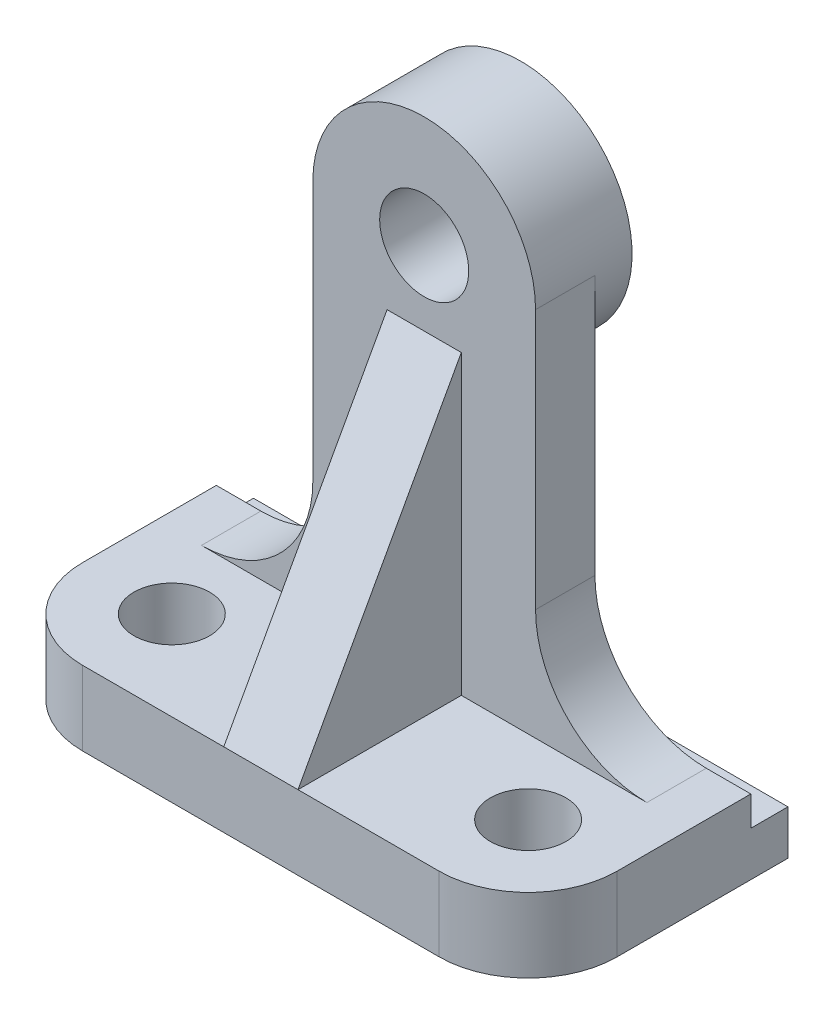
ISO-10303-21;
HEADER;
FILE_DESCRIPTION(('STEP AP214'),'2;1');
FILE_NAME('part.step','',(''),(''),'','','');
FILE_SCHEMA(('AUTOMOTIVE_DESIGN { 1 0 10303 214 1 1 1 1 }'));
ENDSEC;
DATA;
#1=APPLICATION_CONTEXT('core data for automotive mechanical design processes');
#2=APPLICATION_PROTOCOL_DEFINITION('international standard','automotive_design',2000,#1);
#3=PRODUCT_CONTEXT('',#1,'mechanical');
#4=PRODUCT('Part','Part','',(#3));
#5=PRODUCT_RELATED_PRODUCT_CATEGORY('part','',(#4));
#6=PRODUCT_DEFINITION_FORMATION('','',#4);
#7=PRODUCT_DEFINITION_CONTEXT('part definition',#1,'design');
#8=PRODUCT_DEFINITION('design','',#6,#7);
#9=PRODUCT_DEFINITION_SHAPE('','',#8);
#10=(LENGTH_UNIT() NAMED_UNIT(*) SI_UNIT(.MILLI.,.METRE.));
#11=(NAMED_UNIT(*) PLANE_ANGLE_UNIT() SI_UNIT($,.RADIAN.));
#12=(NAMED_UNIT(*) SI_UNIT($,.STERADIAN.) SOLID_ANGLE_UNIT());
#13=UNCERTAINTY_MEASURE_WITH_UNIT(LENGTH_MEASURE(1.E-05),#10,'distance_accuracy_value','');
#14=(GEOMETRIC_REPRESENTATION_CONTEXT(3) GLOBAL_UNCERTAINTY_ASSIGNED_CONTEXT((#13)) GLOBAL_UNIT_ASSIGNED_CONTEXT((#10,
#11,#12)) REPRESENTATION_CONTEXT('',''));
#15=CARTESIAN_POINT('',(0.,0.,0.));
#16=DIRECTION('',(0.,0.,1.));
#17=DIRECTION('',(1.,0.,0.));
#18=AXIS2_PLACEMENT_3D('',#15,#16,#17);
#19=CARTESIAN_POINT('',(0.,10.,0.));
#20=DIRECTION('',(0.,-1.,0.));
#21=DIRECTION('',(0.,0.,-1.));
#22=AXIS2_PLACEMENT_3D('',#19,#20,#21);
#23=PLANE('',#22);
#24=CARTESIAN_POINT('',(-24.,10.,5.5));
#25=DIRECTION('',(0.,-1.,0.));
#26=DIRECTION('',(0.,0.,-1.));
#27=AXIS2_PLACEMENT_3D('',#24,#25,#26);
#28=CIRCLE('',#27,5.09999999999999);
#29=CARTESIAN_POINT('',(-24.,10.,0.40000000000001));
#30=VERTEX_POINT('',#29);
#31=EDGE_CURVE('E290',#30,#30,#28,.T.);
#32=ORIENTED_EDGE('',*,*,#31,.T.);
#33=EDGE_LOOP('',(#32));
#34=FACE_BOUND('',#33,.T.);
#35=DIRECTION('',(0.,0.,1.));
#36=VECTOR('',#35,1.);
#37=CARTESIAN_POINT('',(-5.,10.,0.));
#38=LINE('',#37,#36);
#39=CARTESIAN_POINT('',(-5.,10.,-4.5));
#40=VERTEX_POINT('',#39);
#41=CARTESIAN_POINT('',(-5.,10.,17.5));
#42=VERTEX_POINT('',#41);
#43=EDGE_CURVE('E153',#40,#42,#38,.T.);
#44=ORIENTED_EDGE('',*,*,#43,.F.);
#45=DIRECTION('',(-1.,0.,0.));
#46=VECTOR('',#45,1.);
#47=CARTESIAN_POINT('',(-15.,10.,-4.5));
#48=LINE('',#47,#46);
#49=CARTESIAN_POINT('',(-30.,10.,-4.5));
#50=VERTEX_POINT('',#49);
#51=EDGE_CURVE('E266',#40,#50,#48,.T.);
#52=ORIENTED_EDGE('',*,*,#51,.T.);
#53=DIRECTION('',(0.,0.,-1.));
#54=VECTOR('',#53,1.);
#55=CARTESIAN_POINT('',(-30.,10.,0.));
#56=LINE('',#55,#54);
#57=CARTESIAN_POINT('',(-30.,10.,-12.5));
#58=VERTEX_POINT('',#57);
#59=EDGE_CURVE('E227',#50,#58,#56,.T.);
#60=ORIENTED_EDGE('',*,*,#59,.T.);
#61=DIRECTION('',(1.,0.,0.));
#62=VECTOR('',#61,1.);
#63=CARTESIAN_POINT('',(-36.,10.,-12.5));
#64=LINE('',#63,#62);
#65=CARTESIAN_POINT('',(-36.,10.,-12.5));
#66=VERTEX_POINT('',#65);
#67=EDGE_CURVE('E256',#66,#58,#64,.T.);
#68=ORIENTED_EDGE('',*,*,#67,.F.);
#69=DIRECTION('',(0.,0.,1.));
#70=VECTOR('',#69,1.);
#71=CARTESIAN_POINT('',(-36.,10.,17.5));
#72=LINE('',#71,#70);
#73=CARTESIAN_POINT('',(-36.,10.,5.5));
#74=VERTEX_POINT('',#73);
#75=EDGE_CURVE('E189',#66,#74,#72,.T.);
#76=ORIENTED_EDGE('',*,*,#75,.T.);
#77=CARTESIAN_POINT('',(-24.,10.,5.5));
#78=DIRECTION('',(0.,-1.,0.));
#79=DIRECTION('',(0.,0.,-1.));
#80=AXIS2_PLACEMENT_3D('',#77,#78,#79);
#81=CIRCLE('',#80,12.);
#82=CARTESIAN_POINT('',(-24.,10.,17.5));
#83=VERTEX_POINT('',#82);
#84=EDGE_CURVE('E183',#74,#83,#81,.F.);
#85=ORIENTED_EDGE('',*,*,#84,.T.);
#86=DIRECTION('',(1.,0.,0.));
#87=VECTOR('',#86,1.);
#88=CARTESIAN_POINT('',(-36.,10.,17.5));
#89=LINE('',#88,#87);
#90=EDGE_CURVE('E176',#83,#42,#89,.T.);
#91=ORIENTED_EDGE('',*,*,#90,.T.);
#92=EDGE_LOOP('',(#44,#52,#60,#68,#76,#85,#91));
#93=FACE_BOUND('',#92,.T.);
#94=ADVANCED_FACE('F37',(#34,#93),#23,.F.);
#95=CARTESIAN_POINT('',(-36.,10.,-12.5));
#96=DIRECTION('',(0.,0.,1.));
#97=DIRECTION('',(1.,0.,0.));
#98=AXIS2_PLACEMENT_3D('',#95,#96,#97);
#99=PLANE('',#98);
#100=DIRECTION('',(0.,-1.,0.));
#101=VECTOR('',#100,1.);
#102=CARTESIAN_POINT('',(36.,10.,-12.5));
#103=LINE('',#102,#101);
#104=CARTESIAN_POINT('',(36.,10.,-12.5));
#105=VERTEX_POINT('',#104);
#106=CARTESIAN_POINT('',(36.,6.,-12.5));
#107=VERTEX_POINT('',#106);
#108=EDGE_CURVE('E302',#105,#107,#103,.T.);
#109=ORIENTED_EDGE('',*,*,#108,.T.);
#110=DIRECTION('',(1.,0.,0.));
#111=VECTOR('',#110,1.);
#112=CARTESIAN_POINT('',(-36.,6.,-12.5));
#113=LINE('',#112,#111);
#114=CARTESIAN_POINT('',(-36.,6.,-12.5));
#115=VERTEX_POINT('',#114);
#116=EDGE_CURVE('E313',#115,#107,#113,.T.);
#117=ORIENTED_EDGE('',*,*,#116,.F.);
#118=DIRECTION('',(0.,-1.,0.));
#119=VECTOR('',#118,1.);
#120=CARTESIAN_POINT('',(-36.,10.,-12.5));
#121=LINE('',#120,#119);
#122=EDGE_CURVE('E307',#66,#115,#121,.T.);
#123=ORIENTED_EDGE('',*,*,#122,.F.);
#124=ORIENTED_EDGE('',*,*,#67,.T.);
#125=CARTESIAN_POINT('',(-30.,25.,-12.5));
#126=DIRECTION('',(0.,0.,1.));
#127=DIRECTION('',(1.,0.,0.));
#128=AXIS2_PLACEMENT_3D('',#125,#126,#127);
#129=CIRCLE('',#128,15.);
#130=CARTESIAN_POINT('',(-15.,25.,-12.5));
#131=VERTEX_POINT('',#130);
#132=EDGE_CURVE('E235',#58,#131,#129,.T.);
#133=ORIENTED_EDGE('',*,*,#132,.T.);
#134=DIRECTION('',(0.,1.,0.));
#135=VECTOR('',#134,1.);
#136=CARTESIAN_POINT('',(-15.,60.,-12.5));
#137=LINE('',#136,#135);
#138=CARTESIAN_POINT('',(-15.,60.,-12.5));
#139=VERTEX_POINT('',#138);
#140=EDGE_CURVE('E276',#131,#139,#137,.T.);
#141=ORIENTED_EDGE('',*,*,#140,.T.);
#142=CARTESIAN_POINT('',(0.,60.,-12.5));
#143=DIRECTION('',(0.,0.,-1.));
#144=DIRECTION('',(-1.,0.,0.));
#145=AXIS2_PLACEMENT_3D('',#142,#143,#144);
#146=CIRCLE('',#145,15.);
#147=CARTESIAN_POINT('',(15.,60.,-12.5));
#148=VERTEX_POINT('',#147);
#149=EDGE_CURVE('E431',#148,#139,#146,.T.);
#150=ORIENTED_EDGE('',*,*,#149,.F.);
#151=DIRECTION('',(0.,-1.,0.));
#152=VECTOR('',#151,1.);
#153=CARTESIAN_POINT('',(15.,10.,-12.5));
#154=LINE('',#153,#152);
#155=CARTESIAN_POINT('',(15.,25.,-12.5));
#156=VERTEX_POINT('',#155);
#157=EDGE_CURVE('E247',#148,#156,#154,.T.);
#158=ORIENTED_EDGE('',*,*,#157,.T.);
#159=CARTESIAN_POINT('',(30.,25.,-12.5));
#160=DIRECTION('',(0.,0.,1.));
#161=DIRECTION('',(1.,0.,0.));
#162=AXIS2_PLACEMENT_3D('',#159,#160,#161);
#163=CIRCLE('',#162,15.);
#164=CARTESIAN_POINT('',(30.,10.,-12.5));
#165=VERTEX_POINT('',#164);
#166=EDGE_CURVE('E45',#156,#165,#163,.T.);
#167=ORIENTED_EDGE('',*,*,#166,.T.);
#168=EDGE_CURVE('E244',#165,#105,#64,.T.);
#169=ORIENTED_EDGE('',*,*,#168,.T.);
#170=EDGE_LOOP('',(#109,#117,#123,#124,#133,#141,#150,#158,#167,#169));
#171=FACE_BOUND('',#170,.T.);
#172=ADVANCED_FACE('F243',(#171),#99,.F.);
#173=CARTESIAN_POINT('',(24.,10.,5.5));
#174=DIRECTION('',(0.,-1.,0.));
#175=DIRECTION('',(0.,0.,-1.));
#176=AXIS2_PLACEMENT_3D('',#173,#174,#175);
#177=CIRCLE('',#176,5.09999999999999);
#178=CARTESIAN_POINT('',(24.,10.,0.40000000000001));
#179=VERTEX_POINT('',#178);
#180=EDGE_CURVE('E299',#179,#179,#177,.T.);
#181=ORIENTED_EDGE('',*,*,#180,.T.);
#182=EDGE_LOOP('',(#181));
#183=FACE_BOUND('',#182,.T.);
#184=CARTESIAN_POINT('',(30.,10.,-4.5));
#185=VERTEX_POINT('',#184);
#186=CARTESIAN_POINT('',(5.,10.,-4.5));
#187=VERTEX_POINT('',#186);
#188=EDGE_CURVE('E269',#185,#187,#48,.T.);
#189=ORIENTED_EDGE('',*,*,#188,.T.);
#190=DIRECTION('',(0.,0.,1.));
#191=VECTOR('',#190,1.);
#192=CARTESIAN_POINT('',(5.,10.,0.));
#193=LINE('',#192,#191);
#194=CARTESIAN_POINT('',(5.,10.,17.5));
#195=VERTEX_POINT('',#194);
#196=EDGE_CURVE('E440',#187,#195,#193,.T.);
#197=ORIENTED_EDGE('',*,*,#196,.T.);
#198=CARTESIAN_POINT('',(24.,10.,17.5));
#199=VERTEX_POINT('',#198);
#200=EDGE_CURVE('E179',#195,#199,#89,.T.);
#201=ORIENTED_EDGE('',*,*,#200,.T.);
#202=CARTESIAN_POINT('',(24.,10.,5.5));
#203=DIRECTION('',(0.,-1.,0.));
#204=DIRECTION('',(0.,0.,-1.));
#205=AXIS2_PLACEMENT_3D('',#202,#203,#204);
#206=CIRCLE('',#205,12.);
#207=CARTESIAN_POINT('',(36.,10.,5.5));
#208=VERTEX_POINT('',#207);
#209=EDGE_CURVE('E219',#199,#208,#206,.F.);
#210=ORIENTED_EDGE('',*,*,#209,.T.);
#211=DIRECTION('',(0.,0.,-1.));
#212=VECTOR('',#211,1.);
#213=CARTESIAN_POINT('',(36.,10.,17.5));
#214=LINE('',#213,#212);
#215=EDGE_CURVE('E203',#208,#105,#214,.T.);
#216=ORIENTED_EDGE('',*,*,#215,.T.);
#217=ORIENTED_EDGE('',*,*,#168,.F.);
#218=DIRECTION('',(0.,0.,-1.));
#219=VECTOR('',#218,1.);
#220=CARTESIAN_POINT('',(30.,10.,0.));
#221=LINE('',#220,#219);
#222=EDGE_CURVE('E224',#165,#185,#221,.F.);
#223=ORIENTED_EDGE('',*,*,#222,.T.);
#224=EDGE_LOOP('',(#189,#197,#201,#210,#216,#217,#223));
#225=FACE_BOUND('',#224,.T.);
#226=ADVANCED_FACE('F254',(#183,#225),#23,.F.);
#227=CARTESIAN_POINT('',(36.,10.,17.5));
#228=DIRECTION('',(-1.,0.,0.));
#229=DIRECTION('',(0.,0.,1.));
#230=AXIS2_PLACEMENT_3D('',#227,#228,#229);
#231=PLANE('',#230);
#232=DIRECTION('',(0.,-1.,0.));
#233=VECTOR('',#232,1.);
#234=CARTESIAN_POINT('',(36.,10.,-17.5));
#235=LINE('',#234,#233);
#236=CARTESIAN_POINT('',(36.,6.,-17.5));
#237=VERTEX_POINT('',#236);
#238=CARTESIAN_POINT('',(36.,0.,-17.5));
#239=VERTEX_POINT('',#238);
#240=EDGE_CURVE('E187',#237,#239,#235,.T.);
#241=ORIENTED_EDGE('',*,*,#240,.F.);
#242=DIRECTION('',(0.,0.,-1.));
#243=VECTOR('',#242,1.);
#244=CARTESIAN_POINT('',(36.,6.,-17.5));
#245=LINE('',#244,#243);
#246=EDGE_CURVE('E304',#107,#237,#245,.T.);
#247=ORIENTED_EDGE('',*,*,#246,.F.);
#248=ORIENTED_EDGE('',*,*,#108,.F.);
#249=ORIENTED_EDGE('',*,*,#215,.F.);
#250=DIRECTION('',(0.,-1.,0.));
#251=VECTOR('',#250,1.);
#252=CARTESIAN_POINT('',(36.,10.,5.5));
#253=LINE('',#252,#251);
#254=CARTESIAN_POINT('',(36.,0.,5.5));
#255=VERTEX_POINT('',#254);
#256=EDGE_CURVE('E206',#208,#255,#253,.T.);
#257=ORIENTED_EDGE('',*,*,#256,.T.);
#258=DIRECTION('',(0.,0.,-1.));
#259=VECTOR('',#258,1.);
#260=CARTESIAN_POINT('',(36.,0.,17.5));
#261=LINE('',#260,#259);
#262=EDGE_CURVE('E193',#255,#239,#261,.T.);
#263=ORIENTED_EDGE('',*,*,#262,.T.);
#264=EDGE_LOOP('',(#241,#247,#248,#249,#257,#263));
#265=FACE_BOUND('',#264,.T.);
#266=ADVANCED_FACE('F337',(#265),#231,.F.);
#267=CARTESIAN_POINT('',(-36.,10.,-17.5));
#268=DIRECTION('',(0.,0.,1.));
#269=DIRECTION('',(1.,0.,0.));
#270=AXIS2_PLACEMENT_3D('',#267,#268,#269);
#271=PLANE('',#270);
#272=DIRECTION('',(-1.,0.,0.));
#273=VECTOR('',#272,1.);
#274=CARTESIAN_POINT('',(-36.,0.,-17.5));
#275=LINE('',#274,#273);
#276=CARTESIAN_POINT('',(-36.,0.,-17.5));
#277=VERTEX_POINT('',#276);
#278=EDGE_CURVE('E196',#239,#277,#275,.T.);
#279=ORIENTED_EDGE('',*,*,#278,.T.);
#280=DIRECTION('',(0.,-1.,0.));
#281=VECTOR('',#280,1.);
#282=CARTESIAN_POINT('',(-36.,10.,-17.5));
#283=LINE('',#282,#281);
#284=CARTESIAN_POINT('',(-36.,6.,-17.5));
#285=VERTEX_POINT('',#284);
#286=EDGE_CURVE('E184',#285,#277,#283,.T.);
#287=ORIENTED_EDGE('',*,*,#286,.F.);
#288=DIRECTION('',(1.,0.,0.));
#289=VECTOR('',#288,1.);
#290=CARTESIAN_POINT('',(-36.,6.,-17.5));
#291=LINE('',#290,#289);
#292=EDGE_CURVE('E197',#285,#237,#291,.T.);
#293=ORIENTED_EDGE('',*,*,#292,.T.);
#294=ORIENTED_EDGE('',*,*,#240,.T.);
#295=EDGE_LOOP('',(#279,#287,#293,#294));
#296=FACE_BOUND('',#295,.T.);
#297=ADVANCED_FACE('F344',(#296),#271,.F.);
#298=CARTESIAN_POINT('',(-36.,10.,17.5));
#299=DIRECTION('',(1.,0.,0.));
#300=DIRECTION('',(0.,0.,-1.));
#301=AXIS2_PLACEMENT_3D('',#298,#299,#300);
#302=PLANE('',#301);
#303=ORIENTED_EDGE('',*,*,#122,.T.);
#304=DIRECTION('',(0.,0.,-1.));
#305=VECTOR('',#304,1.);
#306=CARTESIAN_POINT('',(-36.,6.,-17.5));
#307=LINE('',#306,#305);
#308=EDGE_CURVE('E257',#115,#285,#307,.T.);
#309=ORIENTED_EDGE('',*,*,#308,.T.);
#310=ORIENTED_EDGE('',*,*,#286,.T.);
#311=DIRECTION('',(0.,0.,1.));
#312=VECTOR('',#311,1.);
#313=CARTESIAN_POINT('',(-36.,0.,17.5));
#314=LINE('',#313,#312);
#315=CARTESIAN_POINT('',(-36.,0.,5.5));
#316=VERTEX_POINT('',#315);
#317=EDGE_CURVE('E199',#277,#316,#314,.T.);
#318=ORIENTED_EDGE('',*,*,#317,.T.);
#319=DIRECTION('',(0.,-1.,0.));
#320=VECTOR('',#319,1.);
#321=CARTESIAN_POINT('',(-36.,10.,5.5));
#322=LINE('',#321,#320);
#323=EDGE_CURVE('E221',#316,#74,#322,.F.);
#324=ORIENTED_EDGE('',*,*,#323,.T.);
#325=ORIENTED_EDGE('',*,*,#75,.F.);
#326=EDGE_LOOP('',(#303,#309,#310,#318,#324,#325));
#327=FACE_BOUND('',#326,.T.);
#328=ADVANCED_FACE('F319',(#327),#302,.F.);
#329=CARTESIAN_POINT('',(-36.,10.,17.5));
#330=DIRECTION('',(0.,0.,-1.));
#331=DIRECTION('',(-1.,0.,0.));
#332=AXIS2_PLACEMENT_3D('',#329,#330,#331);
#333=PLANE('',#332);
#334=ORIENTED_EDGE('',*,*,#200,.F.);
#335=DIRECTION('',(-1.,0.,0.));
#336=VECTOR('',#335,1.);
#337=CARTESIAN_POINT('',(-36.,10.,17.5));
#338=LINE('',#337,#336);
#339=EDGE_CURVE('E166',#42,#195,#338,.F.);
#340=ORIENTED_EDGE('',*,*,#339,.F.);
#341=ORIENTED_EDGE('',*,*,#90,.F.);
#342=DIRECTION('',(0.,-1.,0.));
#343=VECTOR('',#342,1.);
#344=CARTESIAN_POINT('',(-24.,10.,17.5));
#345=LINE('',#344,#343);
#346=CARTESIAN_POINT('',(-24.,0.,17.5));
#347=VERTEX_POINT('',#346);
#348=EDGE_CURVE('E214',#83,#347,#345,.T.);
#349=ORIENTED_EDGE('',*,*,#348,.T.);
#350=DIRECTION('',(1.,0.,0.));
#351=VECTOR('',#350,1.);
#352=CARTESIAN_POINT('',(-36.,0.,17.5));
#353=LINE('',#352,#351);
#354=CARTESIAN_POINT('',(24.,0.,17.5));
#355=VERTEX_POINT('',#354);
#356=EDGE_CURVE('E202',#347,#355,#353,.T.);
#357=ORIENTED_EDGE('',*,*,#356,.T.);
#358=DIRECTION('',(0.,-1.,0.));
#359=VECTOR('',#358,1.);
#360=CARTESIAN_POINT('',(24.,10.,17.5));
#361=LINE('',#360,#359);
#362=EDGE_CURVE('E216',#355,#199,#361,.F.);
#363=ORIENTED_EDGE('',*,*,#362,.T.);
#364=EDGE_LOOP('',(#334,#340,#341,#349,#357,#363));
#365=FACE_BOUND('',#364,.T.);
#366=ADVANCED_FACE('F174',(#365),#333,.F.);
#367=CARTESIAN_POINT('',(0.,0.,0.));
#368=DIRECTION('',(0.,-1.,0.));
#369=DIRECTION('',(0.,0.,-1.));
#370=AXIS2_PLACEMENT_3D('',#367,#368,#369);
#371=PLANE('',#370);
#372=CARTESIAN_POINT('',(24.,0.,5.5));
#373=DIRECTION('',(0.,-1.,0.));
#374=DIRECTION('',(0.,0.,-1.));
#375=AXIS2_PLACEMENT_3D('',#372,#373,#374);
#376=CIRCLE('',#375,12.);
#377=EDGE_CURVE('E211',#255,#355,#376,.T.);
#378=ORIENTED_EDGE('',*,*,#377,.T.);
#379=ORIENTED_EDGE('',*,*,#356,.F.);
#380=CARTESIAN_POINT('',(-24.,0.,5.5));
#381=DIRECTION('',(0.,-1.,0.));
#382=DIRECTION('',(0.,0.,-1.));
#383=AXIS2_PLACEMENT_3D('',#380,#381,#382);
#384=CIRCLE('',#383,12.);
#385=EDGE_CURVE('E209',#347,#316,#384,.T.);
#386=ORIENTED_EDGE('',*,*,#385,.T.);
#387=ORIENTED_EDGE('',*,*,#317,.F.);
#388=ORIENTED_EDGE('',*,*,#278,.F.);
#389=ORIENTED_EDGE('',*,*,#262,.F.);
#390=EDGE_LOOP('',(#378,#379,#386,#387,#388,#389));
#391=FACE_BOUND('',#390,.T.);
#392=CARTESIAN_POINT('',(24.,0.,5.5));
#393=DIRECTION('',(0.,-1.,0.));
#394=DIRECTION('',(0.,0.,-1.));
#395=AXIS2_PLACEMENT_3D('',#392,#393,#394);
#396=CIRCLE('',#395,6.025);
#397=CARTESIAN_POINT('',(24.,0.,-0.524999999999998));
#398=VERTEX_POINT('',#397);
#399=EDGE_CURVE('E293',#398,#398,#396,.T.);
#400=ORIENTED_EDGE('',*,*,#399,.F.);
#401=EDGE_LOOP('',(#400));
#402=FACE_BOUND('',#401,.T.);
#403=CARTESIAN_POINT('',(-24.,0.,5.5));
#404=DIRECTION('',(0.,-1.,0.));
#405=DIRECTION('',(0.,0.,-1.));
#406=AXIS2_PLACEMENT_3D('',#403,#404,#405);
#407=CIRCLE('',#406,6.025);
#408=CARTESIAN_POINT('',(-24.,0.,-0.524999999999998));
#409=VERTEX_POINT('',#408);
#410=EDGE_CURVE('E282',#409,#409,#407,.T.);
#411=ORIENTED_EDGE('',*,*,#410,.F.);
#412=EDGE_LOOP('',(#411));
#413=FACE_BOUND('',#412,.T.);
#414=ADVANCED_FACE('F325',(#391,#402,#413),#371,.T.);
#415=CARTESIAN_POINT('',(24.,10.,5.5));
#416=DIRECTION('',(0.,-1.,0.));
#417=DIRECTION('',(0.,0.,-1.));
#418=AXIS2_PLACEMENT_3D('',#415,#416,#417);
#419=CYLINDRICAL_SURFACE('',#418,12.);
#420=ORIENTED_EDGE('',*,*,#209,.F.);
#421=ORIENTED_EDGE('',*,*,#362,.F.);
#422=ORIENTED_EDGE('',*,*,#377,.F.);
#423=ORIENTED_EDGE('',*,*,#256,.F.);
#424=EDGE_LOOP('',(#420,#421,#422,#423));
#425=FACE_BOUND('',#424,.T.);
#426=ADVANCED_FACE('F333',(#425),#419,.T.);
#427=CARTESIAN_POINT('',(-24.,10.,5.5));
#428=DIRECTION('',(0.,-1.,0.));
#429=DIRECTION('',(0.,0.,-1.));
#430=AXIS2_PLACEMENT_3D('',#427,#428,#429);
#431=CYLINDRICAL_SURFACE('',#430,12.);
#432=ORIENTED_EDGE('',*,*,#84,.F.);
#433=ORIENTED_EDGE('',*,*,#323,.F.);
#434=ORIENTED_EDGE('',*,*,#385,.F.);
#435=ORIENTED_EDGE('',*,*,#348,.F.);
#436=EDGE_LOOP('',(#432,#433,#434,#435));
#437=FACE_BOUND('',#436,.T.);
#438=ADVANCED_FACE('F322',(#437),#431,.T.);
#439=CARTESIAN_POINT('',(-36.,6.,-17.5));
#440=DIRECTION('',(0.,-1.,0.));
#441=DIRECTION('',(0.,0.,-1.));
#442=AXIS2_PLACEMENT_3D('',#439,#440,#441);
#443=PLANE('',#442);
#444=ORIENTED_EDGE('',*,*,#246,.T.);
#445=ORIENTED_EDGE('',*,*,#292,.F.);
#446=ORIENTED_EDGE('',*,*,#308,.F.);
#447=ORIENTED_EDGE('',*,*,#116,.T.);
#448=EDGE_LOOP('',(#444,#445,#446,#447));
#449=FACE_BOUND('',#448,.T.);
#450=ADVANCED_FACE('F341',(#449),#443,.F.);
#451=CARTESIAN_POINT('',(24.,0.,5.5));
#452=DIRECTION('',(0.,-1.,0.));
#453=DIRECTION('',(0.,0.,-1.));
#454=AXIS2_PLACEMENT_3D('',#451,#452,#453);
#455=CYLINDRICAL_SURFACE('',#454,5.09999999999999);
#456=ORIENTED_EDGE('',*,*,#180,.F.);
#457=EDGE_LOOP('',(#456));
#458=FACE_BOUND('',#457,.T.);
#459=CARTESIAN_POINT('',(24.,0.925000000000009,5.5));
#460=DIRECTION('',(0.,-1.,0.));
#461=DIRECTION('',(0.,0.,-1.));
#462=AXIS2_PLACEMENT_3D('',#459,#460,#461);
#463=CIRCLE('',#462,5.09999999999999);
#464=CARTESIAN_POINT('',(24.,0.925000000000009,0.400000000000015));
#465=VERTEX_POINT('',#464);
#466=EDGE_CURVE('E296',#465,#465,#463,.T.);
#467=ORIENTED_EDGE('',*,*,#466,.T.);
#468=EDGE_LOOP('',(#467));
#469=FACE_BOUND('',#468,.T.);
#470=ADVANCED_FACE('F367',(#458,#469),#455,.F.);
#471=CARTESIAN_POINT('',(24.,0.,5.5));
#472=DIRECTION('',(0.,-1.,0.));
#473=DIRECTION('',(0.,0.,-1.));
#474=AXIS2_PLACEMENT_3D('',#471,#472,#473);
#475=CONICAL_SURFACE('',#474,6.025,0.78539816339745);
#476=ORIENTED_EDGE('',*,*,#466,.F.);
#477=EDGE_LOOP('',(#476));
#478=FACE_BOUND('',#477,.T.);
#479=ORIENTED_EDGE('',*,*,#399,.T.);
#480=EDGE_LOOP('',(#479));
#481=FACE_BOUND('',#480,.T.);
#482=ADVANCED_FACE('F370',(#478,#481),#475,.F.);
#483=CARTESIAN_POINT('',(-24.,0.,5.5));
#484=DIRECTION('',(0.,-1.,0.));
#485=DIRECTION('',(0.,0.,-1.));
#486=AXIS2_PLACEMENT_3D('',#483,#484,#485);
#487=CYLINDRICAL_SURFACE('',#486,5.09999999999999);
#488=ORIENTED_EDGE('',*,*,#31,.F.);
#489=EDGE_LOOP('',(#488));
#490=FACE_BOUND('',#489,.T.);
#491=CARTESIAN_POINT('',(-24.,0.925000000000009,5.5));
#492=DIRECTION('',(0.,-1.,0.));
#493=DIRECTION('',(0.,0.,-1.));
#494=AXIS2_PLACEMENT_3D('',#491,#492,#493);
#495=CIRCLE('',#494,5.09999999999999);
#496=CARTESIAN_POINT('',(-24.,0.925000000000009,0.400000000000015));
#497=VERTEX_POINT('',#496);
#498=EDGE_CURVE('E287',#497,#497,#495,.T.);
#499=ORIENTED_EDGE('',*,*,#498,.T.);
#500=EDGE_LOOP('',(#499));
#501=FACE_BOUND('',#500,.T.);
#502=ADVANCED_FACE('F376',(#490,#501),#487,.F.);
#503=CARTESIAN_POINT('',(-24.,0.,5.5));
#504=DIRECTION('',(0.,-1.,0.));
#505=DIRECTION('',(0.,0.,-1.));
#506=AXIS2_PLACEMENT_3D('',#503,#504,#505);
#507=CONICAL_SURFACE('',#506,6.025,0.78539816339745);
#508=ORIENTED_EDGE('',*,*,#498,.F.);
#509=EDGE_LOOP('',(#508));
#510=FACE_BOUND('',#509,.T.);
#511=ORIENTED_EDGE('',*,*,#410,.T.);
#512=EDGE_LOOP('',(#511));
#513=FACE_BOUND('',#512,.T.);
#514=ADVANCED_FACE('F383',(#510,#513),#507,.F.);
#515=CARTESIAN_POINT('',(-15.,60.,-4.5));
#516=DIRECTION('',(-1.,0.,0.));
#517=DIRECTION('',(0.,-1.,0.));
#518=AXIS2_PLACEMENT_3D('',#515,#516,#517);
#519=PLANE('',#518);
#520=ORIENTED_EDGE('',*,*,#140,.F.);
#521=DIRECTION('',(0.,0.,-1.));
#522=VECTOR('',#521,1.);
#523=CARTESIAN_POINT('',(-15.,25.,-4.5));
#524=LINE('',#523,#522);
#525=CARTESIAN_POINT('',(-15.,25.,-4.5));
#526=VERTEX_POINT('',#525);
#527=EDGE_CURVE('E230',#131,#526,#524,.F.);
#528=ORIENTED_EDGE('',*,*,#527,.T.);
#529=DIRECTION('',(0.,1.,0.));
#530=VECTOR('',#529,1.);
#531=CARTESIAN_POINT('',(-15.,60.,-4.5));
#532=LINE('',#531,#530);
#533=CARTESIAN_POINT('',(-15.,60.,-4.5));
#534=VERTEX_POINT('',#533);
#535=EDGE_CURVE('E271',#526,#534,#532,.T.);
#536=ORIENTED_EDGE('',*,*,#535,.T.);
#537=DIRECTION('',(0.,0.,-1.));
#538=VECTOR('',#537,1.);
#539=CARTESIAN_POINT('',(-15.,60.,-4.5));
#540=LINE('',#539,#538);
#541=EDGE_CURVE('E275',#534,#139,#540,.T.);
#542=ORIENTED_EDGE('',*,*,#541,.T.);
#543=EDGE_LOOP('',(#520,#528,#536,#542));
#544=FACE_BOUND('',#543,.T.);
#545=ADVANCED_FACE('F385',(#544),#519,.T.);
#546=CARTESIAN_POINT('',(15.,10.,-4.5));
#547=DIRECTION('',(1.,0.,0.));
#548=DIRECTION('',(0.,0.,-1.));
#549=AXIS2_PLACEMENT_3D('',#546,#547,#548);
#550=PLANE('',#549);
#551=DIRECTION('',(0.,-1.,0.));
#552=VECTOR('',#551,1.);
#553=CARTESIAN_POINT('',(15.,10.,-4.5));
#554=LINE('',#553,#552);
#555=CARTESIAN_POINT('',(15.,60.,-4.5));
#556=VERTEX_POINT('',#555);
#557=CARTESIAN_POINT('',(15.,25.,-4.5));
#558=VERTEX_POINT('',#557);
#559=EDGE_CURVE('E262',#556,#558,#554,.T.);
#560=ORIENTED_EDGE('',*,*,#559,.T.);
#561=DIRECTION('',(0.,0.,-1.));
#562=VECTOR('',#561,1.);
#563=CARTESIAN_POINT('',(15.,25.,-4.5));
#564=LINE('',#563,#562);
#565=EDGE_CURVE('E232',#558,#156,#564,.T.);
#566=ORIENTED_EDGE('',*,*,#565,.T.);
#567=ORIENTED_EDGE('',*,*,#157,.F.);
#568=DIRECTION('',(0.,0.,-1.));
#569=VECTOR('',#568,1.);
#570=CARTESIAN_POINT('',(15.,60.,-4.5));
#571=LINE('',#570,#569);
#572=EDGE_CURVE('E263',#556,#148,#571,.T.);
#573=ORIENTED_EDGE('',*,*,#572,.F.);
#574=EDGE_LOOP('',(#560,#566,#567,#573));
#575=FACE_BOUND('',#574,.T.);
#576=ADVANCED_FACE('F260',(#575),#550,.T.);
#577=CARTESIAN_POINT('',(0.,60.,-4.5));
#578=DIRECTION('',(0.,0.,-1.));
#579=DIRECTION('',(-1.,0.,0.));
#580=AXIS2_PLACEMENT_3D('',#577,#578,#579);
#581=CYLINDRICAL_SURFACE('',#580,15.);
#582=ORIENTED_EDGE('',*,*,#149,.T.);
#583=ORIENTED_EDGE('',*,*,#541,.F.);
#584=CARTESIAN_POINT('',(0.,60.,-4.5));
#585=DIRECTION('',(0.,0.,-1.));
#586=DIRECTION('',(1.,0.,0.));
#587=AXIS2_PLACEMENT_3D('',#584,#585,#586);
#588=CIRCLE('',#587,15.);
#589=EDGE_CURVE('E267',#534,#556,#588,.T.);
#590=ORIENTED_EDGE('',*,*,#589,.T.);
#591=ORIENTED_EDGE('',*,*,#572,.T.);
#592=EDGE_LOOP('',(#582,#583,#590,#591));
#593=FACE_BOUND('',#592,.T.);
#594=CARTESIAN_POINT('',(0.,60.,-17.5));
#595=DIRECTION('',(0.,0.,-1.));
#596=DIRECTION('',(-1.,0.,0.));
#597=AXIS2_PLACEMENT_3D('',#594,#595,#596);
#598=CIRCLE('',#597,15.);
#599=CARTESIAN_POINT('',(-15.,60.,-17.5));
#600=VERTEX_POINT('',#599);
#601=EDGE_CURVE('E430',#600,#600,#598,.T.);
#602=ORIENTED_EDGE('',*,*,#601,.F.);
#603=EDGE_LOOP('',(#602));
#604=FACE_BOUND('',#603,.T.);
#605=ADVANCED_FACE('F459',(#593,#604),#581,.T.);
#606=CARTESIAN_POINT('',(0.,60.,-4.5));
#607=DIRECTION('',(0.,0.,1.));
#608=DIRECTION('',(1.,0.,0.));
#609=AXIS2_PLACEMENT_3D('',#606,#607,#608);
#610=PLANE('',#609);
#611=DIRECTION('',(0.,1.,0.));
#612=VECTOR('',#611,1.);
#613=CARTESIAN_POINT('',(5.,60.,-4.5));
#614=LINE('',#613,#612);
#615=CARTESIAN_POINT('',(5.,50.,-4.5));
#616=VERTEX_POINT('',#615);
#617=EDGE_CURVE('E438',#187,#616,#614,.T.);
#618=ORIENTED_EDGE('',*,*,#617,.F.);
#619=ORIENTED_EDGE('',*,*,#188,.F.);
#620=CARTESIAN_POINT('',(30.,25.,-4.5));
#621=DIRECTION('',(0.,0.,1.));
#622=DIRECTION('',(1.,0.,0.));
#623=AXIS2_PLACEMENT_3D('',#620,#621,#622);
#624=CIRCLE('',#623,15.);
#625=EDGE_CURVE('E11',#185,#558,#624,.F.);
#626=ORIENTED_EDGE('',*,*,#625,.T.);
#627=ORIENTED_EDGE('',*,*,#559,.F.);
#628=ORIENTED_EDGE('',*,*,#589,.F.);
#629=ORIENTED_EDGE('',*,*,#535,.F.);
#630=CARTESIAN_POINT('',(-30.,25.,-4.5));
#631=DIRECTION('',(0.,0.,1.));
#632=DIRECTION('',(1.,0.,0.));
#633=AXIS2_PLACEMENT_3D('',#630,#631,#632);
#634=CIRCLE('',#633,15.);
#635=EDGE_CURVE('E237',#526,#50,#634,.F.);
#636=ORIENTED_EDGE('',*,*,#635,.T.);
#637=ORIENTED_EDGE('',*,*,#51,.F.);
#638=DIRECTION('',(0.,1.,0.));
#639=VECTOR('',#638,1.);
#640=CARTESIAN_POINT('',(-5.,60.,-4.5));
#641=LINE('',#640,#639);
#642=CARTESIAN_POINT('',(-5.,50.,-4.5));
#643=VERTEX_POINT('',#642);
#644=EDGE_CURVE('E156',#40,#643,#641,.T.);
#645=ORIENTED_EDGE('',*,*,#644,.T.);
#646=DIRECTION('',(1.,0.,0.));
#647=VECTOR('',#646,1.);
#648=CARTESIAN_POINT('',(0.,50.,-4.5));
#649=LINE('',#648,#647);
#650=EDGE_CURVE('E169',#616,#643,#649,.F.);
#651=ORIENTED_EDGE('',*,*,#650,.F.);
#652=EDGE_LOOP('',(#618,#619,#626,#627,#628,#629,#636,#637,#645,#651));
#653=FACE_BOUND('',#652,.T.);
#654=CARTESIAN_POINT('',(0.,60.,-4.5));
#655=DIRECTION('',(0.,0.,-1.));
#656=DIRECTION('',(-1.,0.,0.));
#657=AXIS2_PLACEMENT_3D('',#654,#655,#656);
#658=CIRCLE('',#657,6.);
#659=CARTESIAN_POINT('',(-6.00000000000001,60.,-4.5));
#660=VERTEX_POINT('',#659);
#661=EDGE_CURVE('E279',#660,#660,#658,.T.);
#662=ORIENTED_EDGE('',*,*,#661,.T.);
#663=EDGE_LOOP('',(#662));
#664=FACE_BOUND('',#663,.T.);
#665=ADVANCED_FACE('F417',(#653,#664),#610,.T.);
#666=CARTESIAN_POINT('',(0.,60.,-4.5));
#667=DIRECTION('',(0.,0.,-1.));
#668=DIRECTION('',(-1.,0.,0.));
#669=AXIS2_PLACEMENT_3D('',#666,#667,#668);
#670=CYLINDRICAL_SURFACE('',#669,6.);
#671=CARTESIAN_POINT('',(0.,60.,-17.5));
#672=DIRECTION('',(0.,0.,-1.));
#673=DIRECTION('',(-1.,0.,0.));
#674=AXIS2_PLACEMENT_3D('',#671,#672,#673);
#675=CIRCLE('',#674,6.);
#676=CARTESIAN_POINT('',(-6.00000000000001,60.,-17.5));
#677=VERTEX_POINT('',#676);
#678=EDGE_CURVE('E180',#677,#677,#675,.T.);
#679=ORIENTED_EDGE('',*,*,#678,.T.);
#680=EDGE_LOOP('',(#679));
#681=FACE_BOUND('',#680,.T.);
#682=ORIENTED_EDGE('',*,*,#661,.F.);
#683=EDGE_LOOP('',(#682));
#684=FACE_BOUND('',#683,.T.);
#685=ADVANCED_FACE('F410',(#681,#684),#670,.F.);
#686=CARTESIAN_POINT('',(-30.,25.,0.));
#687=DIRECTION('',(0.,0.,-1.));
#688=DIRECTION('',(-1.,0.,0.));
#689=AXIS2_PLACEMENT_3D('',#686,#687,#688);
#690=CYLINDRICAL_SURFACE('',#689,15.);
#691=ORIENTED_EDGE('',*,*,#635,.F.);
#692=ORIENTED_EDGE('',*,*,#527,.F.);
#693=ORIENTED_EDGE('',*,*,#132,.F.);
#694=ORIENTED_EDGE('',*,*,#59,.F.);
#695=EDGE_LOOP('',(#691,#692,#693,#694));
#696=FACE_BOUND('',#695,.T.);
#697=ADVANCED_FACE('F408',(#696),#690,.F.);
#698=CARTESIAN_POINT('',(30.,25.,-4.5));
#699=DIRECTION('',(0.,0.,-1.));
#700=DIRECTION('',(-1.,0.,0.));
#701=AXIS2_PLACEMENT_3D('',#698,#699,#700);
#702=CYLINDRICAL_SURFACE('',#701,15.);
#703=ORIENTED_EDGE('',*,*,#625,.F.);
#704=ORIENTED_EDGE('',*,*,#222,.F.);
#705=ORIENTED_EDGE('',*,*,#166,.F.);
#706=ORIENTED_EDGE('',*,*,#565,.F.);
#707=EDGE_LOOP('',(#703,#704,#705,#706));
#708=FACE_BOUND('',#707,.T.);
#709=ADVANCED_FACE('F39',(#708),#702,.F.);
#710=CARTESIAN_POINT('',(0.,60.,-17.5));
#711=DIRECTION('',(0.,0.,-1.));
#712=DIRECTION('',(-1.,0.,0.));
#713=AXIS2_PLACEMENT_3D('',#710,#711,#712);
#714=PLANE('',#713);
#715=ORIENTED_EDGE('',*,*,#678,.F.);
#716=EDGE_LOOP('',(#715));
#717=FACE_BOUND('',#716,.T.);
#718=ORIENTED_EDGE('',*,*,#601,.T.);
#719=EDGE_LOOP('',(#718));
#720=FACE_BOUND('',#719,.T.);
#721=ADVANCED_FACE('F416',(#717,#720),#714,.T.);
#722=CARTESIAN_POINT('',(0.,10.,17.5));
#723=DIRECTION('',(0.,-0.481918749772156,-0.876215908676647));
#724=DIRECTION('',(0.,0.876215908676647,-0.481918749772156));
#725=AXIS2_PLACEMENT_3D('',#722,#723,#724);
#726=PLANE('',#725);
#727=DIRECTION('',(0.,0.876215908676647,-0.481918749772156));
#728=VECTOR('',#727,1.);
#729=CARTESIAN_POINT('',(-5.,10.,17.5));
#730=LINE('',#729,#728);
#731=EDGE_CURVE('E52',#42,#643,#730,.T.);
#732=ORIENTED_EDGE('',*,*,#731,.F.);
#733=ORIENTED_EDGE('',*,*,#339,.T.);
#734=DIRECTION('',(0.,0.876215908676647,-0.481918749772156));
#735=VECTOR('',#734,1.);
#736=CARTESIAN_POINT('',(5.,10.,17.5));
#737=LINE('',#736,#735);
#738=EDGE_CURVE('E160',#195,#616,#737,.T.);
#739=ORIENTED_EDGE('',*,*,#738,.T.);
#740=ORIENTED_EDGE('',*,*,#650,.T.);
#741=EDGE_LOOP('',(#732,#733,#739,#740));
#742=FACE_BOUND('',#741,.T.);
#743=ADVANCED_FACE('F164',(#742),#726,.F.);
#744=CARTESIAN_POINT('',(5.,37.5,0.));
#745=DIRECTION('',(1.,0.,0.));
#746=DIRECTION('',(0.,0.,-1.));
#747=AXIS2_PLACEMENT_3D('',#744,#745,#746);
#748=PLANE('',#747);
#749=ORIENTED_EDGE('',*,*,#196,.F.);
#750=ORIENTED_EDGE('',*,*,#617,.T.);
#751=ORIENTED_EDGE('',*,*,#738,.F.);
#752=EDGE_LOOP('',(#749,#750,#751));
#753=FACE_BOUND('',#752,.T.);
#754=ADVANCED_FACE('F444',(#753),#748,.T.);
#755=CARTESIAN_POINT('',(-5.,37.5,0.));
#756=DIRECTION('',(1.,0.,0.));
#757=DIRECTION('',(0.,0.,-1.));
#758=AXIS2_PLACEMENT_3D('',#755,#756,#757);
#759=PLANE('',#758);
#760=ORIENTED_EDGE('',*,*,#644,.F.);
#761=ORIENTED_EDGE('',*,*,#43,.T.);
#762=ORIENTED_EDGE('',*,*,#731,.T.);
#763=EDGE_LOOP('',(#760,#761,#762));
#764=FACE_BOUND('',#763,.T.);
#765=ADVANCED_FACE('F154',(#764),#759,.F.);
#766=CLOSED_SHELL('',(#94,#172,#226,#266,#297,#328,#366,#414,#426,#438,#450,#470,#482,#502,#514,
#545,#576,#605,#665,#685,#697,#709,#721,#743,#754,#765));
#767=MANIFOLD_SOLID_BREP('B2',#766);
#768=ADVANCED_BREP_SHAPE_REPRESENTATION('',(#18,#767),#14);
#769=SHAPE_DEFINITION_REPRESENTATION(#9,#768);
ENDSEC;
END-ISO-10303-21;
